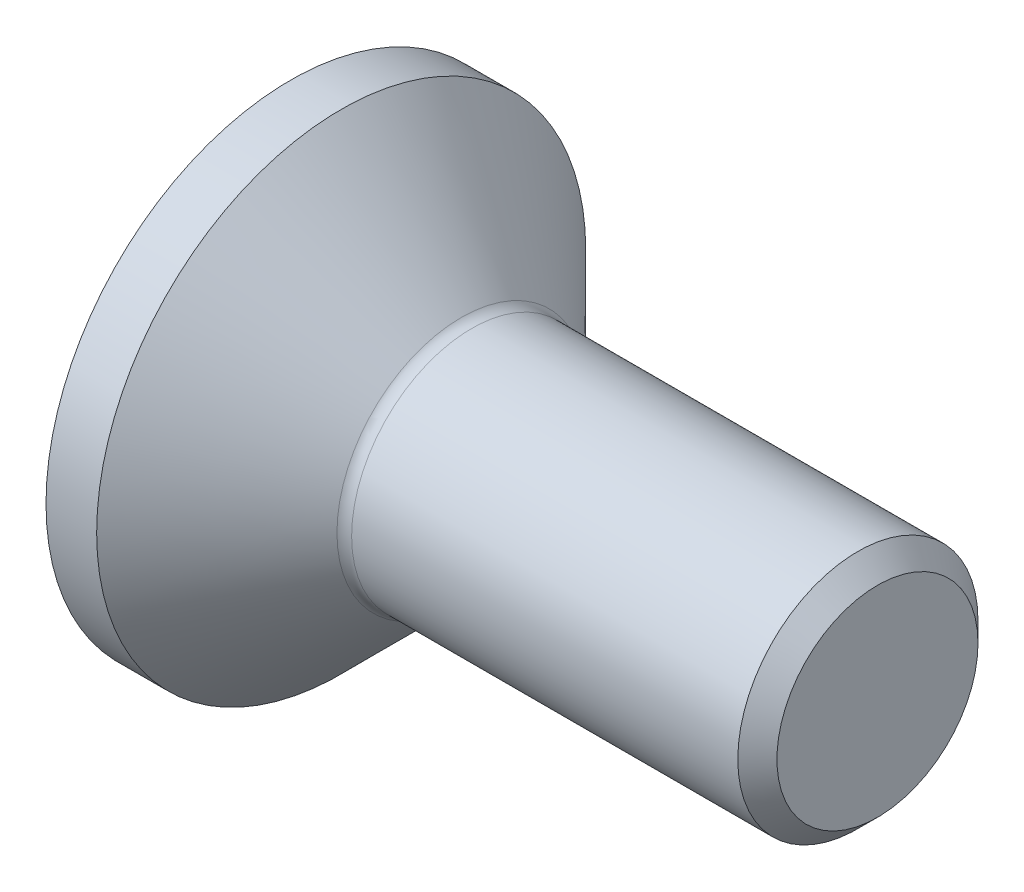
ISO-10303-21;
HEADER;
FILE_DESCRIPTION(('STEP AP214'),'2;1');
FILE_NAME('part.step','',(''),(''),'','','');
FILE_SCHEMA(('AUTOMOTIVE_DESIGN { 1 0 10303 214 1 1 1 1 }'));
ENDSEC;
DATA;
#1=APPLICATION_CONTEXT('core data for automotive mechanical design processes');
#2=APPLICATION_PROTOCOL_DEFINITION('international standard','automotive_design',2000,#1);
#3=PRODUCT_CONTEXT('',#1,'mechanical');
#4=PRODUCT('Part','Part','',(#3));
#5=PRODUCT_RELATED_PRODUCT_CATEGORY('part','',(#4));
#6=PRODUCT_DEFINITION_FORMATION('','',#4);
#7=PRODUCT_DEFINITION_CONTEXT('part definition',#1,'design');
#8=PRODUCT_DEFINITION('design','',#6,#7);
#9=PRODUCT_DEFINITION_SHAPE('','',#8);
#10=(LENGTH_UNIT() NAMED_UNIT(*) SI_UNIT(.MILLI.,.METRE.));
#11=(NAMED_UNIT(*) PLANE_ANGLE_UNIT() SI_UNIT($,.RADIAN.));
#12=(NAMED_UNIT(*) SI_UNIT($,.STERADIAN.) SOLID_ANGLE_UNIT());
#13=UNCERTAINTY_MEASURE_WITH_UNIT(LENGTH_MEASURE(1.E-05),#10,'distance_accuracy_value','');
#14=(GEOMETRIC_REPRESENTATION_CONTEXT(3) GLOBAL_UNCERTAINTY_ASSIGNED_CONTEXT((#13)) GLOBAL_UNIT_ASSIGNED_CONTEXT((#10,
#11,#12)) REPRESENTATION_CONTEXT('',''));
#15=CARTESIAN_POINT('',(0.,0.,0.));
#16=DIRECTION('',(0.,0.,1.));
#17=DIRECTION('',(1.,0.,0.));
#18=AXIS2_PLACEMENT_3D('',#15,#16,#17);
#19=CARTESIAN_POINT('',(0.,0.,0.));
#20=DIRECTION('',(-1.,0.,0.));
#21=DIRECTION('',(0.,0.,1.));
#22=AXIS2_PLACEMENT_3D('',#19,#20,#21);
#23=PLANE('',#22);
#24=CARTESIAN_POINT('',(0.,0.,0.));
#25=DIRECTION('',(-1.,0.,0.));
#26=DIRECTION('',(0.,0.,1.));
#27=AXIS2_PLACEMENT_3D('',#24,#25,#26);
#28=CIRCLE('',#27,5.);
#29=CARTESIAN_POINT('',(0.,0.,5.));
#30=VERTEX_POINT('',#29);
#31=EDGE_CURVE('E174',#30,#30,#28,.T.);
#32=ORIENTED_EDGE('',*,*,#31,.T.);
#33=EDGE_LOOP('',(#32));
#34=FACE_BOUND('',#33,.T.);
#35=DIRECTION('',(0.,-0.5,-0.866025403784439));
#36=VECTOR('',#35,1.);
#37=CARTESIAN_POINT('',(0.,-1.60214699700121,0.925));
#38=LINE('',#37,#36);
#39=CARTESIAN_POINT('',(0.,-1.06809799800081,1.85));
#40=VERTEX_POINT('',#39);
#41=CARTESIAN_POINT('',(0.,-2.13619599600162,0.));
#42=VERTEX_POINT('',#41);
#43=EDGE_CURVE('E98',#40,#42,#38,.T.);
#44=ORIENTED_EDGE('',*,*,#43,.T.);
#45=DIRECTION('',(0.,0.5,-0.866025403784439));
#46=VECTOR('',#45,1.);
#47=CARTESIAN_POINT('',(0.,-1.60214699700121,-0.925));
#48=LINE('',#47,#46);
#49=CARTESIAN_POINT('',(0.,-1.06809799800081,-1.85));
#50=VERTEX_POINT('',#49);
#51=EDGE_CURVE('E69',#42,#50,#48,.T.);
#52=ORIENTED_EDGE('',*,*,#51,.T.);
#53=DIRECTION('',(0.,1.,0.));
#54=VECTOR('',#53,1.);
#55=CARTESIAN_POINT('',(0.,0.,-1.85));
#56=LINE('',#55,#54);
#57=CARTESIAN_POINT('',(0.,1.06809799800081,-1.85));
#58=VERTEX_POINT('',#57);
#59=EDGE_CURVE('E154',#50,#58,#56,.T.);
#60=ORIENTED_EDGE('',*,*,#59,.T.);
#61=DIRECTION('',(0.,0.5,0.866025403784438));
#62=VECTOR('',#61,1.);
#63=CARTESIAN_POINT('',(0.,1.60214699700121,-0.925));
#64=LINE('',#63,#62);
#65=CARTESIAN_POINT('',(0.,2.13619599600161,0.));
#66=VERTEX_POINT('',#65);
#67=EDGE_CURVE('E158',#58,#66,#64,.T.);
#68=ORIENTED_EDGE('',*,*,#67,.T.);
#69=DIRECTION('',(0.,-0.5,0.866025403784438));
#70=VECTOR('',#69,1.);
#71=CARTESIAN_POINT('',(0.,1.60214699700121,0.925));
#72=LINE('',#71,#70);
#73=CARTESIAN_POINT('',(0.,1.06809799800081,1.85));
#74=VERTEX_POINT('',#73);
#75=EDGE_CURVE('E149',#66,#74,#72,.T.);
#76=ORIENTED_EDGE('',*,*,#75,.T.);
#77=DIRECTION('',(0.,-1.,0.));
#78=VECTOR('',#77,1.);
#79=CARTESIAN_POINT('',(0.,0.,1.85));
#80=LINE('',#79,#78);
#81=EDGE_CURVE('E91',#74,#40,#80,.T.);
#82=ORIENTED_EDGE('',*,*,#81,.T.);
#83=EDGE_LOOP('',(#44,#52,#60,#68,#76,#82));
#84=FACE_BOUND('',#83,.T.);
#85=ADVANCED_FACE('F52',(#34,#84),#23,.T.);
#86=CARTESIAN_POINT('',(0.,0.,0.));
#87=DIRECTION('',(-1.,0.,0.));
#88=DIRECTION('',(0.,0.,1.));
#89=AXIS2_PLACEMENT_3D('',#86,#87,#88);
#90=CYLINDRICAL_SURFACE('',#89,5.);
#91=CARTESIAN_POINT('',(1.03563491861041,0.,0.));
#92=DIRECTION('',(-1.,0.,0.));
#93=DIRECTION('',(0.,0.,1.));
#94=AXIS2_PLACEMENT_3D('',#91,#92,#93);
#95=CIRCLE('',#94,5.);
#96=CARTESIAN_POINT('',(1.03563491861041,0.,5.));
#97=VERTEX_POINT('',#96);
#98=EDGE_CURVE('E169',#97,#97,#95,.T.);
#99=ORIENTED_EDGE('',*,*,#98,.T.);
#100=EDGE_LOOP('',(#99));
#101=FACE_BOUND('',#100,.T.);
#102=ORIENTED_EDGE('',*,*,#31,.F.);
#103=EDGE_LOOP('',(#102));
#104=FACE_BOUND('',#103,.T.);
#105=ADVANCED_FACE('F191',(#101,#104),#90,.T.);
#106=CARTESIAN_POINT('',(1.35781745930521,0.,0.));
#107=DIRECTION('',(-1.,0.,0.));
#108=DIRECTION('',(0.,0.,1.));
#109=AXIS2_PLACEMENT_3D('',#106,#107,#108);
#110=CONICAL_SURFACE('',#109,4.6778174593052,0.78539816339745);
#111=CARTESIAN_POINT('',(3.49213203435597,0.,0.));
#112=DIRECTION('',(-1.,0.,0.));
#113=DIRECTION('',(0.,0.,1.));
#114=AXIS2_PLACEMENT_3D('',#111,#112,#113);
#115=CIRCLE('',#114,2.54350288425444);
#116=CARTESIAN_POINT('',(3.49213203435597,0.,2.54350288425444));
#117=VERTEX_POINT('',#116);
#118=EDGE_CURVE('E173',#117,#117,#115,.T.);
#119=ORIENTED_EDGE('',*,*,#118,.T.);
#120=EDGE_LOOP('',(#119));
#121=FACE_BOUND('',#120,.T.);
#122=ORIENTED_EDGE('',*,*,#98,.F.);
#123=EDGE_LOOP('',(#122));
#124=FACE_BOUND('',#123,.T.);
#125=ADVANCED_FACE('F198',(#121,#124),#110,.T.);
#126=CARTESIAN_POINT('',(1.5,-1.96299091524473,-0.3));
#127=DIRECTION('',(0.,0.866025403784439,0.5));
#128=DIRECTION('',(0.,-0.5,0.866025403784439));
#129=AXIS2_PLACEMENT_3D('',#126,#127,#128);
#130=PLANE('',#129);
#131=ORIENTED_EDGE('',*,*,#51,.F.);
#132=DIRECTION('',(-1.,0.,0.));
#133=VECTOR('',#132,1.);
#134=CARTESIAN_POINT('',(1.5,-2.13619599600162,0.));
#135=LINE('',#134,#133);
#136=CARTESIAN_POINT('',(2.1,-2.13619599600162,0.));
#137=VERTEX_POINT('',#136);
#138=EDGE_CURVE('E131',#137,#42,#135,.T.);
#139=ORIENTED_EDGE('',*,*,#138,.F.);
#140=DIRECTION('',(0.,0.5,-0.866025403784439));
#141=VECTOR('',#140,1.);
#142=CARTESIAN_POINT('',(2.1,-1.96299091524473,-0.3));
#143=LINE('',#142,#141);
#144=CARTESIAN_POINT('',(2.1,-1.06809799800081,-1.85));
#145=VERTEX_POINT('',#144);
#146=EDGE_CURVE('E103',#137,#145,#143,.T.);
#147=ORIENTED_EDGE('',*,*,#146,.T.);
#148=DIRECTION('',(-1.,0.,0.));
#149=VECTOR('',#148,1.);
#150=CARTESIAN_POINT('',(1.5,-1.06809799800081,-1.85));
#151=LINE('',#150,#149);
#152=EDGE_CURVE('E145',#145,#50,#151,.T.);
#153=ORIENTED_EDGE('',*,*,#152,.T.);
#154=EDGE_LOOP('',(#131,#139,#147,#153));
#155=FACE_BOUND('',#154,.T.);
#156=ADVANCED_FACE('F135',(#155),#130,.T.);
#157=CARTESIAN_POINT('',(1.5,-0.721687836487033,-1.85));
#158=DIRECTION('',(0.,0.,1.));
#159=DIRECTION('',(0.,-1.,0.));
#160=AXIS2_PLACEMENT_3D('',#157,#158,#159);
#161=PLANE('',#160);
#162=ORIENTED_EDGE('',*,*,#59,.F.);
#163=ORIENTED_EDGE('',*,*,#152,.F.);
#164=DIRECTION('',(0.,1.,0.));
#165=VECTOR('',#164,1.);
#166=CARTESIAN_POINT('',(2.1,-0.721687836487033,-1.85));
#167=LINE('',#166,#165);
#168=CARTESIAN_POINT('',(2.1,1.06809799800081,-1.85));
#169=VERTEX_POINT('',#168);
#170=EDGE_CURVE('E126',#145,#169,#167,.T.);
#171=ORIENTED_EDGE('',*,*,#170,.T.);
#172=DIRECTION('',(-1.,0.,0.));
#173=VECTOR('',#172,1.);
#174=CARTESIAN_POINT('',(1.5,1.06809799800081,-1.85));
#175=LINE('',#174,#173);
#176=EDGE_CURVE('E394',#169,#58,#175,.T.);
#177=ORIENTED_EDGE('',*,*,#176,.T.);
#178=EDGE_LOOP('',(#162,#163,#171,#177));
#179=FACE_BOUND('',#178,.T.);
#180=ADVANCED_FACE('F218',(#179),#161,.T.);
#181=CARTESIAN_POINT('',(1.5,1.24130307875769,-1.55));
#182=DIRECTION('',(0.,-0.866025403784438,0.5));
#183=DIRECTION('',(0.,-0.5,-0.866025403784439));
#184=AXIS2_PLACEMENT_3D('',#181,#182,#183);
#185=PLANE('',#184);
#186=ORIENTED_EDGE('',*,*,#67,.F.);
#187=ORIENTED_EDGE('',*,*,#176,.F.);
#188=DIRECTION('',(0.,0.5,0.866025403784438));
#189=VECTOR('',#188,1.);
#190=CARTESIAN_POINT('',(2.1,1.24130307875769,-1.55));
#191=LINE('',#190,#189);
#192=CARTESIAN_POINT('',(2.1,2.13619599600161,0.));
#193=VERTEX_POINT('',#192);
#194=EDGE_CURVE('E360',#169,#193,#191,.T.);
#195=ORIENTED_EDGE('',*,*,#194,.T.);
#196=DIRECTION('',(-1.,0.,0.));
#197=VECTOR('',#196,1.);
#198=CARTESIAN_POINT('',(1.5,2.13619599600161,0.));
#199=LINE('',#198,#197);
#200=EDGE_CURVE('E398',#193,#66,#199,.T.);
#201=ORIENTED_EDGE('',*,*,#200,.T.);
#202=EDGE_LOOP('',(#186,#187,#195,#201));
#203=FACE_BOUND('',#202,.T.);
#204=ADVANCED_FACE('F221',(#203),#185,.T.);
#205=CARTESIAN_POINT('',(1.5,1.96299091524473,0.3));
#206=DIRECTION('',(0.,-0.866025403784438,-0.5));
#207=DIRECTION('',(0.,0.5,-0.866025403784439));
#208=AXIS2_PLACEMENT_3D('',#205,#206,#207);
#209=PLANE('',#208);
#210=ORIENTED_EDGE('',*,*,#75,.F.);
#211=ORIENTED_EDGE('',*,*,#200,.F.);
#212=DIRECTION('',(0.,-0.5,0.866025403784438));
#213=VECTOR('',#212,1.);
#214=CARTESIAN_POINT('',(2.1,1.96299091524473,0.3));
#215=LINE('',#214,#213);
#216=CARTESIAN_POINT('',(2.1,1.06809799800081,1.85));
#217=VERTEX_POINT('',#216);
#218=EDGE_CURVE('E115',#193,#217,#215,.T.);
#219=ORIENTED_EDGE('',*,*,#218,.T.);
#220=DIRECTION('',(-1.,0.,0.));
#221=VECTOR('',#220,1.);
#222=CARTESIAN_POINT('',(1.5,1.06809799800081,1.85));
#223=LINE('',#222,#221);
#224=EDGE_CURVE('E141',#217,#74,#223,.T.);
#225=ORIENTED_EDGE('',*,*,#224,.T.);
#226=EDGE_LOOP('',(#210,#211,#219,#225));
#227=FACE_BOUND('',#226,.T.);
#228=ADVANCED_FACE('F213',(#227),#209,.T.);
#229=CARTESIAN_POINT('',(1.5,0.721687836487032,1.85));
#230=DIRECTION('',(0.,0.,-1.));
#231=DIRECTION('',(-1.,0.,0.));
#232=AXIS2_PLACEMENT_3D('',#229,#230,#231);
#233=PLANE('',#232);
#234=ORIENTED_EDGE('',*,*,#81,.F.);
#235=ORIENTED_EDGE('',*,*,#224,.F.);
#236=DIRECTION('',(0.,-1.,0.));
#237=VECTOR('',#236,1.);
#238=CARTESIAN_POINT('',(2.1,0.721687836487032,1.85));
#239=LINE('',#238,#237);
#240=CARTESIAN_POINT('',(2.1,-1.06809799800081,1.85));
#241=VERTEX_POINT('',#240);
#242=EDGE_CURVE('E120',#217,#241,#239,.T.);
#243=ORIENTED_EDGE('',*,*,#242,.T.);
#244=DIRECTION('',(-1.,0.,0.));
#245=VECTOR('',#244,1.);
#246=CARTESIAN_POINT('',(1.5,-1.06809799800081,1.85));
#247=LINE('',#246,#245);
#248=EDGE_CURVE('E132',#241,#40,#247,.T.);
#249=ORIENTED_EDGE('',*,*,#248,.T.);
#250=EDGE_LOOP('',(#234,#235,#243,#249));
#251=FACE_BOUND('',#250,.T.);
#252=ADVANCED_FACE('F210',(#251),#233,.T.);
#253=CARTESIAN_POINT('',(1.5,-1.2413030787577,1.55));
#254=DIRECTION('',(0.,0.866025403784439,-0.5));
#255=DIRECTION('',(0.,0.5,0.866025403784439));
#256=AXIS2_PLACEMENT_3D('',#253,#254,#255);
#257=PLANE('',#256);
#258=ORIENTED_EDGE('',*,*,#43,.F.);
#259=ORIENTED_EDGE('',*,*,#248,.F.);
#260=DIRECTION('',(0.,-0.5,-0.866025403784439));
#261=VECTOR('',#260,1.);
#262=CARTESIAN_POINT('',(2.1,-1.2413030787577,1.55));
#263=LINE('',#262,#261);
#264=EDGE_CURVE('E123',#241,#137,#263,.T.);
#265=ORIENTED_EDGE('',*,*,#264,.T.);
#266=ORIENTED_EDGE('',*,*,#138,.T.);
#267=EDGE_LOOP('',(#258,#259,#265,#266));
#268=FACE_BOUND('',#267,.T.);
#269=ADVANCED_FACE('F130',(#268),#257,.T.);
#270=CARTESIAN_POINT('',(2.1,0.,-2.5));
#271=DIRECTION('',(1.,0.,0.));
#272=DIRECTION('',(0.,0.,-1.));
#273=AXIS2_PLACEMENT_3D('',#270,#271,#272);
#274=PLANE('',#273);
#275=CARTESIAN_POINT('',(2.1,0.,0.));
#276=DIRECTION('',(1.,0.,0.));
#277=DIRECTION('',(0.,0.,-1.));
#278=AXIS2_PLACEMENT_3D('',#275,#276,#277);
#279=CIRCLE('',#278,1.81076951545867);
#280=CARTESIAN_POINT('',(2.1,0.,-1.81076951545867));
#281=VERTEX_POINT('',#280);
#282=EDGE_CURVE('E165',#281,#281,#279,.F.);
#283=ORIENTED_EDGE('',*,*,#282,.F.);
#284=EDGE_LOOP('',(#283));
#285=FACE_BOUND('',#284,.T.);
#286=ORIENTED_EDGE('',*,*,#170,.F.);
#287=ORIENTED_EDGE('',*,*,#146,.F.);
#288=ORIENTED_EDGE('',*,*,#264,.F.);
#289=ORIENTED_EDGE('',*,*,#242,.F.);
#290=ORIENTED_EDGE('',*,*,#218,.F.);
#291=ORIENTED_EDGE('',*,*,#194,.F.);
#292=EDGE_LOOP('',(#286,#287,#288,#289,#290,#291));
#293=FACE_BOUND('',#292,.T.);
#294=ADVANCED_FACE('F124',(#285,#293),#274,.F.);
#295=CARTESIAN_POINT('',(2.19282032302755,0.,0.));
#296=DIRECTION('',(-1.,0.,0.));
#297=DIRECTION('',(0.,0.,1.));
#298=AXIS2_PLACEMENT_3D('',#295,#296,#297);
#299=CONICAL_SURFACE('',#298,1.65,1.0471975511966);
#300=CARTESIAN_POINT('',(3.14544826719043,0.,0.));
#301=VERTEX_POINT('',#300);
#302=VERTEX_LOOP('',#301);
#303=FACE_BOUND('',#302,.T.);
#304=ORIENTED_EDGE('',*,*,#282,.T.);
#305=EDGE_LOOP('',(#304));
#306=FACE_BOUND('',#305,.T.);
#307=ADVANCED_FACE('F216',(#303,#306),#299,.F.);
#308=CARTESIAN_POINT('',(3.58,0.,0.));
#309=DIRECTION('',(1.,0.,0.));
#310=DIRECTION('',(0.,0.,-1.));
#311=AXIS2_PLACEMENT_3D('',#308,#309,#310);
#312=CYLINDRICAL_SURFACE('',#311,2.4556349186104);
#313=CARTESIAN_POINT('',(11.6,0.,0.));
#314=DIRECTION('',(1.,0.,0.));
#315=DIRECTION('',(0.,0.,-1.));
#316=AXIS2_PLACEMENT_3D('',#313,#314,#315);
#317=CIRCLE('',#316,2.4556349186104);
#318=CARTESIAN_POINT('',(11.6,0.,-2.4556349186104));
#319=VERTEX_POINT('',#318);
#320=EDGE_CURVE('E13',#319,#319,#317,.F.);
#321=ORIENTED_EDGE('',*,*,#320,.T.);
#322=EDGE_LOOP('',(#321));
#323=FACE_BOUND('',#322,.T.);
#324=CARTESIAN_POINT('',(3.70426406871193,0.,0.));
#325=DIRECTION('',(1.,0.,0.));
#326=DIRECTION('',(0.,0.,-1.));
#327=AXIS2_PLACEMENT_3D('',#324,#325,#326);
#328=CIRCLE('',#327,2.4556349186104);
#329=CARTESIAN_POINT('',(3.70426406871193,0.,-2.4556349186104));
#330=VERTEX_POINT('',#329);
#331=EDGE_CURVE('E170',#330,#330,#328,.T.);
#332=ORIENTED_EDGE('',*,*,#331,.T.);
#333=EDGE_LOOP('',(#332));
#334=FACE_BOUND('',#333,.T.);
#335=ADVANCED_FACE('F204',(#323,#334),#312,.T.);
#336=CARTESIAN_POINT('',(12.,0.,0.));
#337=DIRECTION('',(1.,0.,0.));
#338=DIRECTION('',(0.,0.,-1.));
#339=AXIS2_PLACEMENT_3D('',#336,#337,#338);
#340=PLANE('',#339);
#341=CARTESIAN_POINT('',(12.,0.,0.));
#342=DIRECTION('',(1.,0.,0.));
#343=DIRECTION('',(0.,0.,-1.));
#344=AXIS2_PLACEMENT_3D('',#341,#342,#343);
#345=CIRCLE('',#344,2.0556349186104);
#346=CARTESIAN_POINT('',(12.,0.,-2.0556349186104));
#347=VERTEX_POINT('',#346);
#348=EDGE_CURVE('E62',#347,#347,#345,.T.);
#349=ORIENTED_EDGE('',*,*,#348,.T.);
#350=EDGE_LOOP('',(#349));
#351=FACE_BOUND('',#350,.T.);
#352=ADVANCED_FACE('F179',(#351),#340,.T.);
#353=CARTESIAN_POINT('',(3.70426406871193,0.,0.));
#354=DIRECTION('',(1.,0.,0.));
#355=DIRECTION('',(0.,0.,-1.));
#356=AXIS2_PLACEMENT_3D('',#353,#354,#355);
#357=TOROIDAL_SURFACE('',#356,2.7556349186104,0.3);
#358=ORIENTED_EDGE('',*,*,#118,.F.);
#359=EDGE_LOOP('',(#358));
#360=FACE_BOUND('',#359,.T.);
#361=ORIENTED_EDGE('',*,*,#331,.F.);
#362=EDGE_LOOP('',(#361));
#363=FACE_BOUND('',#362,.T.);
#364=ADVANCED_FACE('F182',(#360,#363),#357,.F.);
#365=CARTESIAN_POINT('',(12.,0.,0.));
#366=DIRECTION('',(-1.,0.,0.));
#367=DIRECTION('',(0.,0.,1.));
#368=AXIS2_PLACEMENT_3D('',#365,#366,#367);
#369=CONICAL_SURFACE('',#368,2.0556349186104,0.785398163397446);
#370=ORIENTED_EDGE('',*,*,#320,.F.);
#371=EDGE_LOOP('',(#370));
#372=FACE_BOUND('',#371,.T.);
#373=ORIENTED_EDGE('',*,*,#348,.F.);
#374=EDGE_LOOP('',(#373));
#375=FACE_BOUND('',#374,.T.);
#376=ADVANCED_FACE('F55',(#372,#375),#369,.T.);
#377=CLOSED_SHELL('',(#85,#105,#125,#156,#180,#204,#228,#252,#269,#294,#307,#335,#352,#364,#376));
#378=MANIFOLD_SOLID_BREP('B2',#377);
#379=ADVANCED_BREP_SHAPE_REPRESENTATION('',(#18,#378),#14);
#380=SHAPE_DEFINITION_REPRESENTATION(#9,#379);
ENDSEC;
END-ISO-10303-21;
